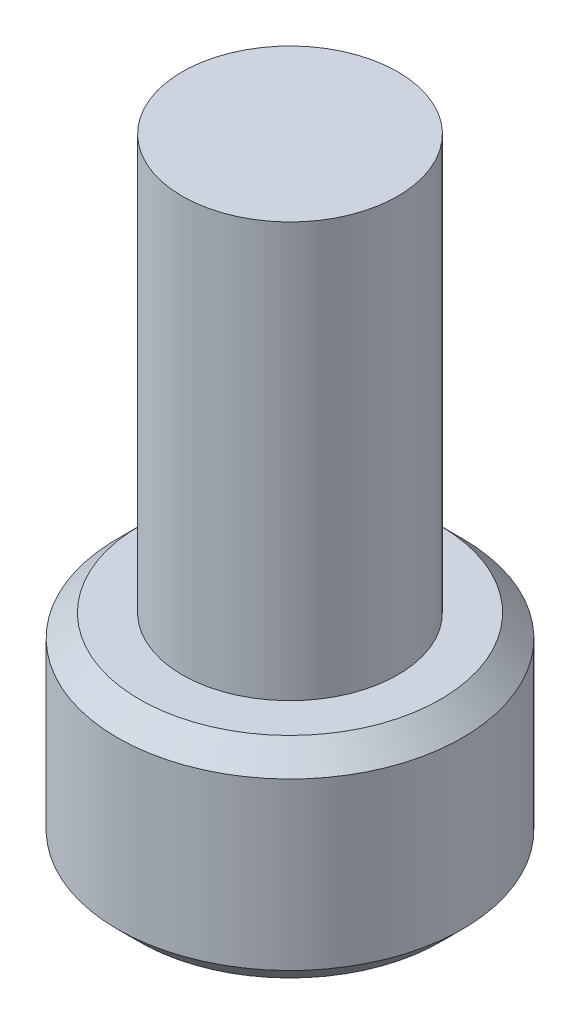
ISO-10303-21;
HEADER;
FILE_DESCRIPTION(('STEP AP214'),'2;1');
FILE_NAME('part.step','',(''),(''),'','','');
FILE_SCHEMA(('AUTOMOTIVE_DESIGN { 1 0 10303 214 1 1 1 1 }'));
ENDSEC;
DATA;
#1=APPLICATION_CONTEXT('core data for automotive mechanical design processes');
#2=APPLICATION_PROTOCOL_DEFINITION('international standard','automotive_design',2000,#1);
#3=PRODUCT_CONTEXT('',#1,'mechanical');
#4=PRODUCT('Part','Part','',(#3));
#5=PRODUCT_RELATED_PRODUCT_CATEGORY('part','',(#4));
#6=PRODUCT_DEFINITION_FORMATION('','',#4);
#7=PRODUCT_DEFINITION_CONTEXT('part definition',#1,'design');
#8=PRODUCT_DEFINITION('design','',#6,#7);
#9=PRODUCT_DEFINITION_SHAPE('','',#8);
#10=(LENGTH_UNIT() NAMED_UNIT(*) SI_UNIT(.MILLI.,.METRE.));
#11=(NAMED_UNIT(*) PLANE_ANGLE_UNIT() SI_UNIT($,.RADIAN.));
#12=(NAMED_UNIT(*) SI_UNIT($,.STERADIAN.) SOLID_ANGLE_UNIT());
#13=UNCERTAINTY_MEASURE_WITH_UNIT(LENGTH_MEASURE(1.E-05),#10,'distance_accuracy_value','');
#14=(GEOMETRIC_REPRESENTATION_CONTEXT(3) GLOBAL_UNCERTAINTY_ASSIGNED_CONTEXT((#13)) GLOBAL_UNIT_ASSIGNED_CONTEXT((#10,
#11,#12)) REPRESENTATION_CONTEXT('',''));
#15=CARTESIAN_POINT('',(0.,0.,0.));
#16=DIRECTION('',(0.,0.,1.));
#17=DIRECTION('',(1.,0.,0.));
#18=AXIS2_PLACEMENT_3D('',#15,#16,#17);
#19=CARTESIAN_POINT('',(0.,9.525,0.));
#20=DIRECTION('',(0.,-1.,0.));
#21=DIRECTION('',(0.,0.,-1.));
#22=AXIS2_PLACEMENT_3D('',#19,#20,#21);
#23=CYLINDRICAL_SURFACE('',#22,2.4765);
#24=CARTESIAN_POINT('',(0.,9.525,0.));
#25=DIRECTION('',(0.,1.,0.));
#26=DIRECTION('',(0.,0.,1.));
#27=AXIS2_PLACEMENT_3D('',#24,#25,#26);
#28=CIRCLE('',#27,2.4765);
#29=CARTESIAN_POINT('',(0.,9.525,-2.4765));
#30=VERTEX_POINT('',#29);
#31=EDGE_CURVE('E150',#30,#30,#28,.T.);
#32=CARTESIAN_POINT('',(0.,0.,0.));
#33=DIRECTION('',(0.,1.,0.));
#34=DIRECTION('',(0.,0.,1.));
#35=AXIS2_PLACEMENT_3D('',#32,#33,#34);
#36=CIRCLE('',#35,2.4765);
#37=CARTESIAN_POINT('',(0.,0.,-2.4765));
#38=VERTEX_POINT('',#37);
#39=EDGE_CURVE('E144',#38,#38,#36,.T.);
#40=CARTESIAN_POINT('',(0.,9.525,-2.4765));
#41=CARTESIAN_POINT('',(0.,9.42578125,-2.4765));
#42=CARTESIAN_POINT('',(0.,9.3265625,-2.4765));
#43=CARTESIAN_POINT('',(0.,9.128125,-2.4765));
#44=CARTESIAN_POINT('',(0.,9.02890625,-2.4765));
#45=CARTESIAN_POINT('',(0.,8.83046875,-2.4765));
#46=CARTESIAN_POINT('',(0.,8.73125,-2.4765));
#47=CARTESIAN_POINT('',(0.,8.5328125,-2.4765));
#48=CARTESIAN_POINT('',(0.,8.43359375,-2.4765));
#49=CARTESIAN_POINT('',(0.,8.23515625,-2.4765));
#50=CARTESIAN_POINT('',(0.,8.1359375,-2.4765));
#51=CARTESIAN_POINT('',(0.,7.9375,-2.4765));
#52=CARTESIAN_POINT('',(0.,7.83828125,-2.4765));
#53=CARTESIAN_POINT('',(0.,7.63984375,-2.4765));
#54=CARTESIAN_POINT('',(0.,7.540625,-2.4765));
#55=CARTESIAN_POINT('',(0.,7.3421875,-2.4765));
#56=CARTESIAN_POINT('',(0.,7.24296875,-2.4765));
#57=CARTESIAN_POINT('',(0.,7.04453125,-2.4765));
#58=CARTESIAN_POINT('',(0.,6.9453125,-2.4765));
#59=CARTESIAN_POINT('',(0.,6.746875,-2.4765));
#60=CARTESIAN_POINT('',(0.,6.64765625,-2.4765));
#61=CARTESIAN_POINT('',(0.,6.44921875,-2.4765));
#62=CARTESIAN_POINT('',(0.,6.35,-2.4765));
#63=CARTESIAN_POINT('',(0.,6.1515625,-2.4765));
#64=CARTESIAN_POINT('',(0.,6.05234375,-2.4765));
#65=CARTESIAN_POINT('',(0.,5.85390625,-2.4765));
#66=CARTESIAN_POINT('',(0.,5.7546875,-2.4765));
#67=CARTESIAN_POINT('',(0.,5.55625,-2.4765));
#68=CARTESIAN_POINT('',(0.,5.45703125,-2.4765));
#69=CARTESIAN_POINT('',(0.,5.25859375,-2.4765));
#70=CARTESIAN_POINT('',(0.,5.159375,-2.4765));
#71=CARTESIAN_POINT('',(0.,4.9609375,-2.4765));
#72=CARTESIAN_POINT('',(0.,4.86171875,-2.4765));
#73=CARTESIAN_POINT('',(0.,4.66328125,-2.4765));
#74=CARTESIAN_POINT('',(0.,4.5640625,-2.4765));
#75=CARTESIAN_POINT('',(0.,4.365625,-2.4765));
#76=CARTESIAN_POINT('',(0.,4.26640625,-2.4765));
#77=CARTESIAN_POINT('',(0.,4.06796875,-2.4765));
#78=CARTESIAN_POINT('',(0.,3.96875,-2.4765));
#79=CARTESIAN_POINT('',(0.,3.7703125,-2.4765));
#80=CARTESIAN_POINT('',(0.,3.67109375,-2.4765));
#81=CARTESIAN_POINT('',(0.,3.47265625,-2.4765));
#82=CARTESIAN_POINT('',(0.,3.3734375,-2.4765));
#83=CARTESIAN_POINT('',(0.,3.175,-2.4765));
#84=CARTESIAN_POINT('',(0.,3.07578125,-2.4765));
#85=CARTESIAN_POINT('',(0.,2.87734375,-2.4765));
#86=CARTESIAN_POINT('',(0.,2.778125,-2.4765));
#87=CARTESIAN_POINT('',(0.,2.5796875,-2.4765));
#88=CARTESIAN_POINT('',(0.,2.48046875,-2.4765));
#89=CARTESIAN_POINT('',(0.,2.28203125,-2.4765));
#90=CARTESIAN_POINT('',(0.,2.1828125,-2.4765));
#91=CARTESIAN_POINT('',(0.,1.984375,-2.4765));
#92=CARTESIAN_POINT('',(0.,1.88515625,-2.4765));
#93=CARTESIAN_POINT('',(0.,1.68671875,-2.4765));
#94=CARTESIAN_POINT('',(0.,1.5875,-2.4765));
#95=CARTESIAN_POINT('',(0.,1.3890625,-2.4765));
#96=CARTESIAN_POINT('',(0.,1.28984375,-2.4765));
#97=CARTESIAN_POINT('',(0.,1.09140625,-2.4765));
#98=CARTESIAN_POINT('',(0.,0.992187500000001,-2.4765));
#99=CARTESIAN_POINT('',(0.,0.793750000000001,-2.4765));
#100=CARTESIAN_POINT('',(0.,0.69453125,-2.4765));
#101=CARTESIAN_POINT('',(0.,0.49609375,-2.4765));
#102=CARTESIAN_POINT('',(0.,0.396875,-2.4765));
#103=CARTESIAN_POINT('',(0.,0.1984375,-2.4765));
#104=CARTESIAN_POINT('',(0.,0.0992187500000001,-2.4765));
#105=CARTESIAN_POINT('',(0.,0.,-2.4765));
#106=B_SPLINE_CURVE_WITH_KNOTS('',3,(#40,#41,#42,#43,#44,#45,#46,#47,#48,#49,#50,#51,#52,#53,
#54,#55,#56,#57,#58,#59,#60,#61,#62,#63,#64,#65,#66,#67,#68,#69,#70,#71,#72,#73,#74,#75,#76,#77,
#78,#79,#80,#81,#82,#83,#84,#85,#86,#87,#88,#89,#90,#91,#92,#93,#94,#95,#96,#97,#98,#99,#100,
#101,#102,#103,#104,#105),.UNSPECIFIED.,.F.,.F.,(4,2,2,2,2,2,2,2,2,2,2,2,2,2,2,2,2,2,2,2,2,2,2,
2,2,2,2,2,2,2,2,2,4),(0.,0.297656249999998,0.595312499999999,0.892968749999999,1.190625,
1.48828125,1.7859375,2.08359375,2.38125,2.67890625,2.9765625,3.27421875,3.571875,3.86953125,
4.1671875,4.46484375,4.7625,5.06015625,5.3578125,5.65546875,5.953125,6.25078125,6.5484375,
6.84609375,7.14375,7.44140625,7.7390625,8.03671875,8.334375,8.63203125,8.9296875,9.22734375,
9.525),.UNSPECIFIED.);
#107=EDGE_CURVE('BSEAM41',#30,#38,#106,.T.);
#108=ORIENTED_EDGE('',*,*,#31,.F.);
#109=ORIENTED_EDGE('',*,*,#39,.T.);
#110=ORIENTED_EDGE('',*,*,#107,.T.);
#111=ORIENTED_EDGE('',*,*,#107,.F.);
#112=EDGE_LOOP('',(#108,#110,#109,#111));
#113=FACE_BOUND('',#112,.T.);
#114=ADVANCED_FACE('F41',(#113),#23,.T.);
#115=CARTESIAN_POINT('',(0.,9.525,0.));
#116=DIRECTION('',(0.,1.,0.));
#117=DIRECTION('',(0.,0.,1.));
#118=AXIS2_PLACEMENT_3D('',#115,#116,#117);
#119=PLANE('',#118);
#120=ORIENTED_EDGE('',*,*,#31,.T.);
#121=EDGE_LOOP('',(#120));
#122=FACE_BOUND('',#121,.T.);
#123=ADVANCED_FACE('F175',(#122),#119,.T.);
#124=CARTESIAN_POINT('',(0.,-4.826,0.));
#125=DIRECTION('',(0.,1.,0.));
#126=DIRECTION('',(0.,0.,1.));
#127=AXIS2_PLACEMENT_3D('',#124,#125,#126);
#128=CYLINDRICAL_SURFACE('',#127,3.9624);
#129=CARTESIAN_POINT('',(0.,-0.508,0.));
#130=DIRECTION('',(0.,-1.,0.));
#131=DIRECTION('',(0.,0.,-1.));
#132=AXIS2_PLACEMENT_3D('',#129,#130,#131);
#133=CIRCLE('',#132,3.9624);
#134=CARTESIAN_POINT('',(0.,-0.508,-3.9624));
#135=VERTEX_POINT('',#134);
#136=EDGE_CURVE('E158',#135,#135,#133,.T.);
#137=ORIENTED_EDGE('',*,*,#136,.T.);
#138=EDGE_LOOP('',(#137));
#139=FACE_BOUND('',#138,.T.);
#140=CARTESIAN_POINT('',(0.,-4.318,0.));
#141=DIRECTION('',(0.,-1.,0.));
#142=DIRECTION('',(0.,0.,-1.));
#143=AXIS2_PLACEMENT_3D('',#140,#141,#142);
#144=CIRCLE('',#143,3.9624);
#145=CARTESIAN_POINT('',(0.,-4.318,-3.9624));
#146=VERTEX_POINT('',#145);
#147=EDGE_CURVE('E153',#146,#146,#144,.F.);
#148=ORIENTED_EDGE('',*,*,#147,.T.);
#149=EDGE_LOOP('',(#148));
#150=FACE_BOUND('',#149,.T.);
#151=ADVANCED_FACE('F171',(#139,#150),#128,.T.);
#152=CARTESIAN_POINT('',(0.,-4.826,0.));
#153=DIRECTION('',(0.,-1.,0.));
#154=DIRECTION('',(0.,0.,-1.));
#155=AXIS2_PLACEMENT_3D('',#152,#153,#154);
#156=PLANE('',#155);
#157=CARTESIAN_POINT('',(0.,-4.826,0.));
#158=DIRECTION('',(0.,-1.,0.));
#159=DIRECTION('',(0.,0.,-1.));
#160=AXIS2_PLACEMENT_3D('',#157,#158,#159);
#161=CIRCLE('',#160,3.4544);
#162=CARTESIAN_POINT('',(0.,-4.826,-3.4544));
#163=VERTEX_POINT('',#162);
#164=EDGE_CURVE('E11',#163,#163,#161,.T.);
#165=ORIENTED_EDGE('',*,*,#164,.T.);
#166=EDGE_LOOP('',(#165));
#167=FACE_BOUND('',#166,.T.);
#168=DIRECTION('',(0.5,0.,0.866025403784439));
#169=VECTOR('',#168,1.);
#170=CARTESIAN_POINT('',(1.14567944042316,-4.826,-1.984375));
#171=LINE('',#170,#169);
#172=CARTESIAN_POINT('',(1.14567944042316,-4.826,-1.984375));
#173=VERTEX_POINT('',#172);
#174=CARTESIAN_POINT('',(2.29135888084633,-4.826,0.));
#175=VERTEX_POINT('',#174);
#176=EDGE_CURVE('E57',#173,#175,#171,.T.);
#177=ORIENTED_EDGE('',*,*,#176,.F.);
#178=DIRECTION('',(1.,0.,0.));
#179=VECTOR('',#178,1.);
#180=CARTESIAN_POINT('',(-1.14567944042316,-4.826,-1.984375));
#181=LINE('',#180,#179);
#182=CARTESIAN_POINT('',(-1.14567944042316,-4.826,-1.984375));
#183=VERTEX_POINT('',#182);
#184=EDGE_CURVE('E140',#183,#173,#181,.T.);
#185=ORIENTED_EDGE('',*,*,#184,.F.);
#186=DIRECTION('',(0.5,0.,-0.866025403784439));
#187=VECTOR('',#186,1.);
#188=CARTESIAN_POINT('',(-2.29135888084633,-4.826,0.));
#189=LINE('',#188,#187);
#190=CARTESIAN_POINT('',(-2.29135888084633,-4.826,0.));
#191=VERTEX_POINT('',#190);
#192=EDGE_CURVE('E138',#191,#183,#189,.T.);
#193=ORIENTED_EDGE('',*,*,#192,.F.);
#194=DIRECTION('',(-0.5,0.,-0.866025403784439));
#195=VECTOR('',#194,1.);
#196=CARTESIAN_POINT('',(-1.14567944042316,-4.826,1.984375));
#197=LINE('',#196,#195);
#198=CARTESIAN_POINT('',(-1.14567944042316,-4.826,1.984375));
#199=VERTEX_POINT('',#198);
#200=EDGE_CURVE('E105',#199,#191,#197,.T.);
#201=ORIENTED_EDGE('',*,*,#200,.F.);
#202=DIRECTION('',(-1.,0.,0.));
#203=VECTOR('',#202,1.);
#204=CARTESIAN_POINT('',(1.14567944042316,-4.826,1.984375));
#205=LINE('',#204,#203);
#206=CARTESIAN_POINT('',(1.14567944042316,-4.826,1.984375));
#207=VERTEX_POINT('',#206);
#208=EDGE_CURVE('E134',#207,#199,#205,.T.);
#209=ORIENTED_EDGE('',*,*,#208,.F.);
#210=DIRECTION('',(-0.5,0.,0.866025403784439));
#211=VECTOR('',#210,1.);
#212=CARTESIAN_POINT('',(2.29135888084633,-4.826,0.));
#213=LINE('',#212,#211);
#214=EDGE_CURVE('E131',#175,#207,#213,.T.);
#215=ORIENTED_EDGE('',*,*,#214,.F.);
#216=EDGE_LOOP('',(#177,#185,#193,#201,#209,#215));
#217=FACE_BOUND('',#216,.T.);
#218=ADVANCED_FACE('F174',(#167,#217),#156,.T.);
#219=CARTESIAN_POINT('',(0.,0.,0.));
#220=DIRECTION('',(0.,-1.,0.));
#221=DIRECTION('',(0.,0.,-1.));
#222=AXIS2_PLACEMENT_3D('',#219,#220,#221);
#223=PLANE('',#222);
#224=CARTESIAN_POINT('',(0.,0.,0.));
#225=DIRECTION('',(0.,-1.,0.));
#226=DIRECTION('',(0.,0.,-1.));
#227=AXIS2_PLACEMENT_3D('',#224,#225,#226);
#228=CIRCLE('',#227,3.4544);
#229=CARTESIAN_POINT('',(0.,0.,-3.4544));
#230=VERTEX_POINT('',#229);
#231=EDGE_CURVE('E50',#230,#230,#228,.F.);
#232=ORIENTED_EDGE('',*,*,#231,.T.);
#233=EDGE_LOOP('',(#232));
#234=FACE_BOUND('',#233,.T.);
#235=ORIENTED_EDGE('',*,*,#39,.F.);
#236=EDGE_LOOP('',(#235));
#237=FACE_BOUND('',#236,.T.);
#238=ADVANCED_FACE('F163',(#234,#237),#223,.F.);
#239=CARTESIAN_POINT('',(1.14567944042316,-2.54,-1.984375));
#240=DIRECTION('',(0.866025403784439,0.,-0.5));
#241=DIRECTION('',(-0.5,0.,-0.866025403784439));
#242=AXIS2_PLACEMENT_3D('',#239,#240,#241);
#243=PLANE('',#242);
#244=ORIENTED_EDGE('',*,*,#176,.T.);
#245=DIRECTION('',(0.,-1.,0.));
#246=VECTOR('',#245,1.);
#247=CARTESIAN_POINT('',(2.29135888084633,-2.54,0.));
#248=LINE('',#247,#246);
#249=CARTESIAN_POINT('',(2.29135888084633,-2.54,0.));
#250=VERTEX_POINT('',#249);
#251=EDGE_CURVE('E87',#250,#175,#248,.T.);
#252=ORIENTED_EDGE('',*,*,#251,.F.);
#253=DIRECTION('',(0.5,0.,0.866025403784439));
#254=VECTOR('',#253,1.);
#255=CARTESIAN_POINT('',(1.14567944042316,-2.54,-1.984375));
#256=LINE('',#255,#254);
#257=CARTESIAN_POINT('',(1.14567944042316,-2.54,-1.984375));
#258=VERTEX_POINT('',#257);
#259=EDGE_CURVE('E142',#258,#250,#256,.T.);
#260=ORIENTED_EDGE('',*,*,#259,.F.);
#261=DIRECTION('',(0.,-1.,0.));
#262=VECTOR('',#261,1.);
#263=CARTESIAN_POINT('',(1.14567944042316,-2.54,-1.984375));
#264=LINE('',#263,#262);
#265=EDGE_CURVE('E65',#258,#173,#264,.T.);
#266=ORIENTED_EDGE('',*,*,#265,.T.);
#267=EDGE_LOOP('',(#244,#252,#260,#266));
#268=FACE_BOUND('',#267,.T.);
#269=ADVANCED_FACE('F192',(#268),#243,.F.);
#270=CARTESIAN_POINT('',(-1.14567944042316,-2.54,-1.984375));
#271=DIRECTION('',(0.,0.,-1.));
#272=DIRECTION('',(-1.,0.,0.));
#273=AXIS2_PLACEMENT_3D('',#270,#271,#272);
#274=PLANE('',#273);
#275=ORIENTED_EDGE('',*,*,#184,.T.);
#276=ORIENTED_EDGE('',*,*,#265,.F.);
#277=DIRECTION('',(1.,0.,0.));
#278=VECTOR('',#277,1.);
#279=CARTESIAN_POINT('',(-1.14567944042316,-2.54,-1.984375));
#280=LINE('',#279,#278);
#281=CARTESIAN_POINT('',(-1.14567944042316,-2.54,-1.984375));
#282=VERTEX_POINT('',#281);
#283=EDGE_CURVE('E117',#282,#258,#280,.T.);
#284=ORIENTED_EDGE('',*,*,#283,.F.);
#285=DIRECTION('',(0.,-1.,0.));
#286=VECTOR('',#285,1.);
#287=CARTESIAN_POINT('',(-1.14567944042316,-2.54,-1.984375));
#288=LINE('',#287,#286);
#289=EDGE_CURVE('E109',#282,#183,#288,.T.);
#290=ORIENTED_EDGE('',*,*,#289,.T.);
#291=EDGE_LOOP('',(#275,#276,#284,#290));
#292=FACE_BOUND('',#291,.T.);
#293=ADVANCED_FACE('F194',(#292),#274,.F.);
#294=CARTESIAN_POINT('',(-2.29135888084633,-2.54,0.));
#295=DIRECTION('',(-0.866025403784439,0.,-0.5));
#296=DIRECTION('',(-0.5,0.,0.866025403784439));
#297=AXIS2_PLACEMENT_3D('',#294,#295,#296);
#298=PLANE('',#297);
#299=ORIENTED_EDGE('',*,*,#192,.T.);
#300=ORIENTED_EDGE('',*,*,#289,.F.);
#301=DIRECTION('',(0.5,0.,-0.866025403784439));
#302=VECTOR('',#301,1.);
#303=CARTESIAN_POINT('',(-2.29135888084633,-2.54,0.));
#304=LINE('',#303,#302);
#305=CARTESIAN_POINT('',(-2.29135888084633,-2.54,0.));
#306=VERTEX_POINT('',#305);
#307=EDGE_CURVE('E113',#306,#282,#304,.T.);
#308=ORIENTED_EDGE('',*,*,#307,.F.);
#309=DIRECTION('',(0.,-1.,0.));
#310=VECTOR('',#309,1.);
#311=CARTESIAN_POINT('',(-2.29135888084633,-2.54,0.));
#312=LINE('',#311,#310);
#313=EDGE_CURVE('E98',#306,#191,#312,.T.);
#314=ORIENTED_EDGE('',*,*,#313,.T.);
#315=EDGE_LOOP('',(#299,#300,#308,#314));
#316=FACE_BOUND('',#315,.T.);
#317=ADVANCED_FACE('F114',(#316),#298,.F.);
#318=CARTESIAN_POINT('',(-1.14567944042316,-2.54,1.984375));
#319=DIRECTION('',(-0.866025403784439,0.,0.5));
#320=DIRECTION('',(0.5,0.,0.866025403784439));
#321=AXIS2_PLACEMENT_3D('',#318,#319,#320);
#322=PLANE('',#321);
#323=ORIENTED_EDGE('',*,*,#200,.T.);
#324=ORIENTED_EDGE('',*,*,#313,.F.);
#325=DIRECTION('',(-0.5,0.,-0.866025403784439));
#326=VECTOR('',#325,1.);
#327=CARTESIAN_POINT('',(-1.14567944042316,-2.54,1.984375));
#328=LINE('',#327,#326);
#329=CARTESIAN_POINT('',(-1.14567944042316,-2.54,1.984375));
#330=VERTEX_POINT('',#329);
#331=EDGE_CURVE('E102',#330,#306,#328,.T.);
#332=ORIENTED_EDGE('',*,*,#331,.F.);
#333=DIRECTION('',(0.,-1.,0.));
#334=VECTOR('',#333,1.);
#335=CARTESIAN_POINT('',(-1.14567944042316,-2.54,1.984375));
#336=LINE('',#335,#334);
#337=EDGE_CURVE('E110',#330,#199,#336,.T.);
#338=ORIENTED_EDGE('',*,*,#337,.T.);
#339=EDGE_LOOP('',(#323,#324,#332,#338));
#340=FACE_BOUND('',#339,.T.);
#341=ADVANCED_FACE('F100',(#340),#322,.F.);
#342=CARTESIAN_POINT('',(1.14567944042316,-2.54,1.984375));
#343=DIRECTION('',(0.,0.,1.));
#344=DIRECTION('',(1.,0.,0.));
#345=AXIS2_PLACEMENT_3D('',#342,#343,#344);
#346=PLANE('',#345);
#347=ORIENTED_EDGE('',*,*,#208,.T.);
#348=ORIENTED_EDGE('',*,*,#337,.F.);
#349=DIRECTION('',(-1.,0.,0.));
#350=VECTOR('',#349,1.);
#351=CARTESIAN_POINT('',(1.14567944042316,-2.54,1.984375));
#352=LINE('',#351,#350);
#353=CARTESIAN_POINT('',(1.14567944042316,-2.54,1.984375));
#354=VERTEX_POINT('',#353);
#355=EDGE_CURVE('E123',#354,#330,#352,.T.);
#356=ORIENTED_EDGE('',*,*,#355,.F.);
#357=DIRECTION('',(0.,-1.,0.));
#358=VECTOR('',#357,1.);
#359=CARTESIAN_POINT('',(1.14567944042316,-2.54,1.984375));
#360=LINE('',#359,#358);
#361=EDGE_CURVE('E147',#354,#207,#360,.T.);
#362=ORIENTED_EDGE('',*,*,#361,.T.);
#363=EDGE_LOOP('',(#347,#348,#356,#362));
#364=FACE_BOUND('',#363,.T.);
#365=ADVANCED_FACE('F271',(#364),#346,.F.);
#366=CARTESIAN_POINT('',(2.29135888084633,-2.54,0.));
#367=DIRECTION('',(0.866025403784439,0.,0.5));
#368=DIRECTION('',(0.5,0.,-0.866025403784439));
#369=AXIS2_PLACEMENT_3D('',#366,#367,#368);
#370=PLANE('',#369);
#371=ORIENTED_EDGE('',*,*,#214,.T.);
#372=ORIENTED_EDGE('',*,*,#361,.F.);
#373=DIRECTION('',(-0.5,0.,0.866025403784439));
#374=VECTOR('',#373,1.);
#375=CARTESIAN_POINT('',(2.29135888084633,-2.54,0.));
#376=LINE('',#375,#374);
#377=EDGE_CURVE('E125',#250,#354,#376,.T.);
#378=ORIENTED_EDGE('',*,*,#377,.F.);
#379=ORIENTED_EDGE('',*,*,#251,.T.);
#380=EDGE_LOOP('',(#371,#372,#378,#379));
#381=FACE_BOUND('',#380,.T.);
#382=ADVANCED_FACE('F190',(#381),#370,.F.);
#383=CARTESIAN_POINT('',(0.,-2.54,0.));
#384=DIRECTION('',(0.,-1.,0.));
#385=DIRECTION('',(0.,0.,-1.));
#386=AXIS2_PLACEMENT_3D('',#383,#384,#385);
#387=PLANE('',#386);
#388=ORIENTED_EDGE('',*,*,#259,.T.);
#389=ORIENTED_EDGE('',*,*,#377,.T.);
#390=ORIENTED_EDGE('',*,*,#355,.T.);
#391=ORIENTED_EDGE('',*,*,#331,.T.);
#392=ORIENTED_EDGE('',*,*,#307,.T.);
#393=ORIENTED_EDGE('',*,*,#283,.T.);
#394=EDGE_LOOP('',(#388,#389,#390,#391,#392,#393));
#395=FACE_BOUND('',#394,.T.);
#396=ADVANCED_FACE('F120',(#395),#387,.T.);
#397=CARTESIAN_POINT('',(0.,-0.508,0.));
#398=DIRECTION('',(0.,-1.,0.));
#399=DIRECTION('',(0.,0.,-1.));
#400=AXIS2_PLACEMENT_3D('',#397,#398,#399);
#401=CONICAL_SURFACE('',#400,3.9624,0.78539816339745);
#402=ORIENTED_EDGE('',*,*,#231,.F.);
#403=EDGE_LOOP('',(#402));
#404=FACE_BOUND('',#403,.T.);
#405=ORIENTED_EDGE('',*,*,#136,.F.);
#406=EDGE_LOOP('',(#405));
#407=FACE_BOUND('',#406,.T.);
#408=ADVANCED_FACE('F166',(#404,#407),#401,.T.);
#409=CARTESIAN_POINT('',(0.,-4.826,0.));
#410=DIRECTION('',(0.,1.,0.));
#411=DIRECTION('',(0.,0.,1.));
#412=AXIS2_PLACEMENT_3D('',#409,#410,#411);
#413=CONICAL_SURFACE('',#412,3.4544,0.785398163397447);
#414=ORIENTED_EDGE('',*,*,#147,.F.);
#415=EDGE_LOOP('',(#414));
#416=FACE_BOUND('',#415,.T.);
#417=ORIENTED_EDGE('',*,*,#164,.F.);
#418=EDGE_LOOP('',(#417));
#419=FACE_BOUND('',#418,.T.);
#420=ADVANCED_FACE('F44',(#416,#419),#413,.T.);
#421=CLOSED_SHELL('',(#114,#123,#151,#218,#238,#269,#293,#317,#341,#365,#382,#396,#408,#420));
#422=MANIFOLD_SOLID_BREP('B2',#421);
#423=ADVANCED_BREP_SHAPE_REPRESENTATION('',(#18,#422),#14);
#424=SHAPE_DEFINITION_REPRESENTATION(#9,#423);
ENDSEC;
END-ISO-10303-21;
